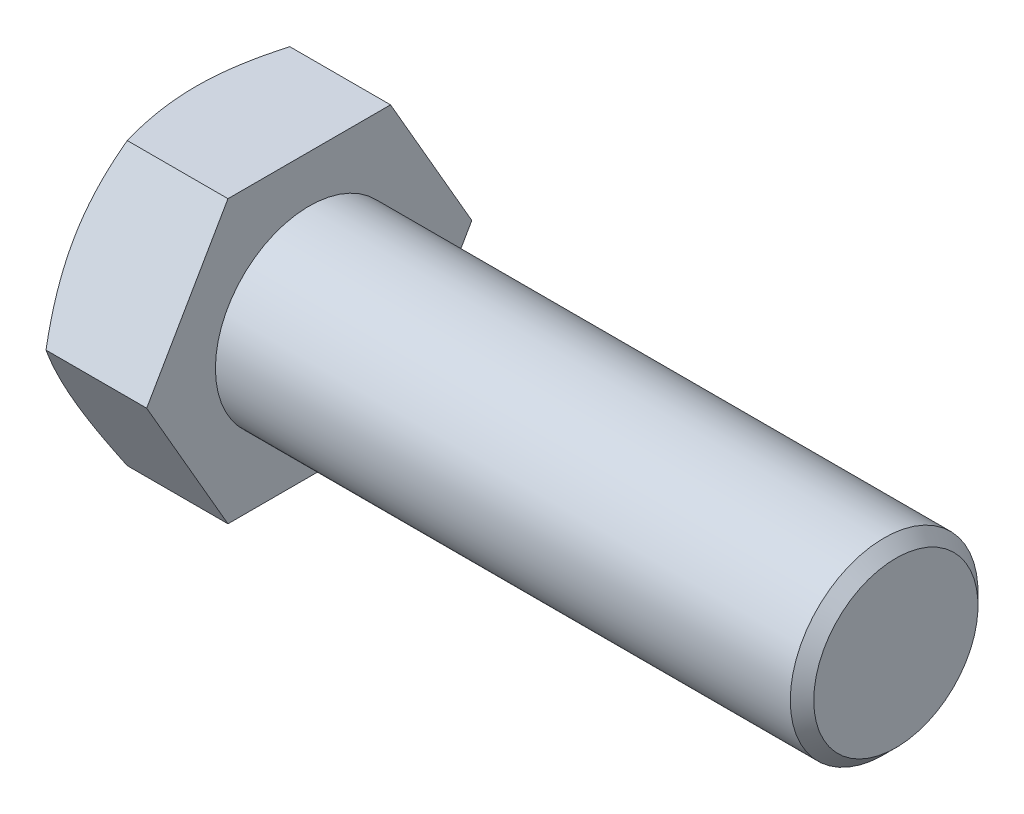
ISO-10303-21;
HEADER;
FILE_DESCRIPTION(('STEP AP214'),'2;1');
FILE_NAME('part.step','',(''),(''),'','','');
FILE_SCHEMA(('AUTOMOTIVE_DESIGN { 1 0 10303 214 1 1 1 1 }'));
ENDSEC;
DATA;
#1=APPLICATION_CONTEXT('core data for automotive mechanical design processes');
#2=APPLICATION_PROTOCOL_DEFINITION('international standard','automotive_design',2000,#1);
#3=PRODUCT_CONTEXT('',#1,'mechanical');
#4=PRODUCT('Part','Part','',(#3));
#5=PRODUCT_RELATED_PRODUCT_CATEGORY('part','',(#4));
#6=PRODUCT_DEFINITION_FORMATION('','',#4);
#7=PRODUCT_DEFINITION_CONTEXT('part definition',#1,'design');
#8=PRODUCT_DEFINITION('design','',#6,#7);
#9=PRODUCT_DEFINITION_SHAPE('','',#8);
#10=(LENGTH_UNIT() NAMED_UNIT(*) SI_UNIT(.MILLI.,.METRE.));
#11=(NAMED_UNIT(*) PLANE_ANGLE_UNIT() SI_UNIT($,.RADIAN.));
#12=(NAMED_UNIT(*) SI_UNIT($,.STERADIAN.) SOLID_ANGLE_UNIT());
#13=UNCERTAINTY_MEASURE_WITH_UNIT(LENGTH_MEASURE(1.E-05),#10,'distance_accuracy_value','');
#14=(GEOMETRIC_REPRESENTATION_CONTEXT(3) GLOBAL_UNCERTAINTY_ASSIGNED_CONTEXT((#13)) GLOBAL_UNIT_ASSIGNED_CONTEXT((#10,
#11,#12)) REPRESENTATION_CONTEXT('',''));
#15=CARTESIAN_POINT('',(0.,0.,0.));
#16=DIRECTION('',(0.,0.,1.));
#17=DIRECTION('',(1.,0.,0.));
#18=AXIS2_PLACEMENT_3D('',#15,#16,#17);
#19=CARTESIAN_POINT('',(5.,6.93,0.));
#20=DIRECTION('',(-1.,0.,0.));
#21=DIRECTION('',(0.,0.,1.));
#22=AXIS2_PLACEMENT_3D('',#19,#20,#21);
#23=PLANE('',#22);
#24=DIRECTION('',(0.,0.,-1.));
#25=VECTOR('',#24,1.);
#26=CARTESIAN_POINT('',(5.,-6.,0.));
#27=LINE('',#26,#25);
#28=CARTESIAN_POINT('',(5.,-6.,3.46410161513776));
#29=VERTEX_POINT('',#28);
#30=CARTESIAN_POINT('',(5.,-6.,-3.46410161513775));
#31=VERTEX_POINT('',#30);
#32=EDGE_CURVE('E91',#29,#31,#27,.T.);
#33=ORIENTED_EDGE('',*,*,#32,.T.);
#34=DIRECTION('',(0.,0.866025403784439,-0.5));
#35=VECTOR('',#34,1.);
#36=CARTESIAN_POINT('',(5.,2.1975,-8.19693044681971));
#37=LINE('',#36,#35);
#38=CARTESIAN_POINT('',(5.,0.,-6.92820323027551));
#39=VERTEX_POINT('',#38);
#40=EDGE_CURVE('E127',#31,#39,#37,.T.);
#41=ORIENTED_EDGE('',*,*,#40,.T.);
#42=DIRECTION('',(0.,0.866025403784439,0.5));
#43=VECTOR('',#42,1.);
#44=CARTESIAN_POINT('',(5.,8.1975,-2.19537439859355));
#45=LINE('',#44,#43);
#46=CARTESIAN_POINT('',(5.,6.,-3.46410161513775));
#47=VERTEX_POINT('',#46);
#48=EDGE_CURVE('E123',#39,#47,#45,.T.);
#49=ORIENTED_EDGE('',*,*,#48,.T.);
#50=DIRECTION('',(0.,0.,1.));
#51=VECTOR('',#50,1.);
#52=CARTESIAN_POINT('',(5.,6.,0.));
#53=LINE('',#52,#51);
#54=CARTESIAN_POINT('',(5.,6.,3.46410161513775));
#55=VERTEX_POINT('',#54);
#56=EDGE_CURVE('E117',#47,#55,#53,.T.);
#57=ORIENTED_EDGE('',*,*,#56,.T.);
#58=DIRECTION('',(0.,-0.866025403784439,0.5));
#59=VECTOR('',#58,1.);
#60=CARTESIAN_POINT('',(5.,8.1975,2.19537439859355));
#61=LINE('',#60,#59);
#62=CARTESIAN_POINT('',(5.,0.,6.92820323027551));
#63=VERTEX_POINT('',#62);
#64=EDGE_CURVE('E113',#55,#63,#61,.T.);
#65=ORIENTED_EDGE('',*,*,#64,.T.);
#66=DIRECTION('',(0.,-0.866025403784439,-0.5));
#67=VECTOR('',#66,1.);
#68=CARTESIAN_POINT('',(5.,2.1975,8.19693044681971));
#69=LINE('',#68,#67);
#70=EDGE_CURVE('E97',#63,#29,#69,.T.);
#71=ORIENTED_EDGE('',*,*,#70,.T.);
#72=EDGE_LOOP('',(#33,#41,#49,#57,#65,#71));
#73=FACE_BOUND('',#72,.T.);
#74=CARTESIAN_POINT('',(5.,0.,0.));
#75=DIRECTION('',(-1.,0.,0.));
#76=DIRECTION('',(0.,0.,1.));
#77=AXIS2_PLACEMENT_3D('',#74,#75,#76);
#78=CIRCLE('',#77,4.);
#79=CARTESIAN_POINT('',(5.,0.,4.));
#80=VERTEX_POINT('',#79);
#81=EDGE_CURVE('E298',#80,#80,#78,.T.);
#82=ORIENTED_EDGE('',*,*,#81,.T.);
#83=EDGE_LOOP('',(#82));
#84=FACE_BOUND('',#83,.T.);
#85=ADVANCED_FACE('F40',(#73,#84),#23,.F.);
#86=CARTESIAN_POINT('',(0.,0.,0.));
#87=DIRECTION('',(-1.,0.,0.));
#88=DIRECTION('',(0.,0.,1.));
#89=AXIS2_PLACEMENT_3D('',#86,#87,#88);
#90=CYLINDRICAL_SURFACE('',#89,4.);
#91=CARTESIAN_POINT('',(29.5,0.,0.));
#92=DIRECTION('',(-1.,0.,0.));
#93=DIRECTION('',(0.,0.,1.));
#94=AXIS2_PLACEMENT_3D('',#91,#92,#93);
#95=CIRCLE('',#94,4.);
#96=CARTESIAN_POINT('',(29.5,0.,4.));
#97=VERTEX_POINT('',#96);
#98=EDGE_CURVE('E49',#97,#97,#95,.T.);
#99=ORIENTED_EDGE('',*,*,#98,.T.);
#100=EDGE_LOOP('',(#99));
#101=FACE_BOUND('',#100,.T.);
#102=ORIENTED_EDGE('',*,*,#81,.F.);
#103=EDGE_LOOP('',(#102));
#104=FACE_BOUND('',#103,.T.);
#105=ADVANCED_FACE('F133',(#101,#104),#90,.T.);
#106=CARTESIAN_POINT('',(30.,4.,0.));
#107=DIRECTION('',(-1.,0.,0.));
#108=DIRECTION('',(0.,0.,1.));
#109=AXIS2_PLACEMENT_3D('',#106,#107,#108);
#110=PLANE('',#109);
#111=CARTESIAN_POINT('',(30.,0.,0.));
#112=DIRECTION('',(-1.,0.,0.));
#113=DIRECTION('',(0.,0.,1.));
#114=AXIS2_PLACEMENT_3D('',#111,#112,#113);
#115=CIRCLE('',#114,3.49999999999999);
#116=CARTESIAN_POINT('',(30.,0.,3.49999999999999));
#117=VERTEX_POINT('',#116);
#118=EDGE_CURVE('E12',#117,#117,#115,.F.);
#119=ORIENTED_EDGE('',*,*,#118,.T.);
#120=EDGE_LOOP('',(#119));
#121=FACE_BOUND('',#120,.T.);
#122=ADVANCED_FACE('F151',(#121),#110,.F.);
#123=CARTESIAN_POINT('',(30.,-6.,-3.46410161513775));
#124=DIRECTION('',(0.,0.5,0.866025403784439));
#125=DIRECTION('',(0.,-0.866025403784439,0.5));
#126=AXIS2_PLACEMENT_3D('',#123,#124,#125);
#127=PLANE('',#126);
#128=DIRECTION('',(-1.,0.,0.));
#129=VECTOR('',#128,1.);
#130=CARTESIAN_POINT('',(30.,0.,-6.92820323027551));
#131=LINE('',#130,#129);
#132=CARTESIAN_POINT('',(0.709103465619134,0.,-6.92820323027551));
#133=VERTEX_POINT('',#132);
#134=EDGE_CURVE('E307',#39,#133,#131,.T.);
#135=ORIENTED_EDGE('',*,*,#134,.F.);
#136=ORIENTED_EDGE('',*,*,#40,.F.);
#137=DIRECTION('',(-1.,0.,0.));
#138=VECTOR('',#137,1.);
#139=CARTESIAN_POINT('',(30.,-6.,-3.46410161513775));
#140=LINE('',#139,#138);
#141=CARTESIAN_POINT('',(0.709103465619136,-6.,-3.46410161513775));
#142=VERTEX_POINT('',#141);
#143=EDGE_CURVE('E61',#31,#142,#140,.T.);
#144=ORIENTED_EDGE('',*,*,#143,.T.);
#145=CARTESIAN_POINT('',(0.70917013395244,0.000200000000000979,-6.92831870032934));
#146=CARTESIAN_POINT('',(0.665214079872815,-0.131687014824874,-6.85217369681759));
#147=CARTESIAN_POINT('',(0.623252887977289,-0.264065768516573,-6.7757447877387));
#148=CARTESIAN_POINT('',(0.543869657551678,-0.529898336283079,-6.62226628317934));
#149=CARTESIAN_POINT('',(0.506449577152535,-0.66335258784951,-6.54521643511296));
#150=CARTESIAN_POINT('',(0.401735490843066,-1.06585213146133,-6.31283321525997));
#151=CARTESIAN_POINT('',(0.342175138138793,-1.33648623295938,-6.15658254390818));
#152=CARTESIAN_POINT('',(0.272333291472117,-1.74148524632806,-5.92275625451824));
#153=CARTESIAN_POINT('',(0.252437308808714,-1.87464004873788,-5.84587929350304));
#154=CARTESIAN_POINT('',(0.219074495555851,-2.14155132192066,-5.69177799808121));
#155=CARTESIAN_POINT('',(0.205607096915758,-2.27530773847834,-5.6145536949758));
#156=CARTESIAN_POINT('',(0.185444672507247,-2.54305288876907,-5.45997096038123));
#157=CARTESIAN_POINT('',(0.178741960756744,-2.67704118518633,-5.38261278137646));
#158=CARTESIAN_POINT('',(0.172245444167011,-2.94513416595058,-5.22782922676437));
#159=CARTESIAN_POINT('',(0.172451425904961,-3.07923884657427,-5.1504038533067));
#160=CARTESIAN_POINT('',(0.182512265982597,-3.44664501267683,-4.93828180440546));
#161=CARTESIAN_POINT('',(0.199402973759165,-3.6798262391765,-4.8036545605159));
#162=CARTESIAN_POINT('',(0.252964303547458,-4.14463991639404,-4.53529425885134));
#163=CARTESIAN_POINT('',(0.289653233720647,-4.3762707323519,-4.40156214490545));
#164=CARTESIAN_POINT('',(0.381365207452591,-4.84201989935198,-4.13266173796312));
#165=CARTESIAN_POINT('',(0.436776837467547,-5.07607947956512,-3.99752737632065));
#166=CARTESIAN_POINT('',(0.562538993940273,-5.54070808652961,-3.7292739250165));
#167=CARTESIAN_POINT('',(0.632859978073063,-5.77128306395569,-3.59615139973116));
#168=CARTESIAN_POINT('',(0.709170133952441,-6.0002,-3.46398614508391));
#169=B_SPLINE_CURVE_WITH_KNOTS('',3,(#145,#146,#147,#148,#149,#150,#151,#152,#153,#154,#155,
#156,#157,#158,#159,#160,#161,#162,#163,#164,#165,#166,#167,#168),.UNSPECIFIED.,.F.,.F.,(4,2,2,
2,2,2,2,2,2,2,2,4),(0.,0.475482194578525,0.951168694392477,1.90451835622161,2.36951738073402,
2.83447530880776,3.29890435872167,3.76331906154278,4.57182194271094,5.38107376137308,
6.20827406017204,7.03385036012984),.UNSPECIFIED.);
#170=EDGE_CURVE('E198',#133,#142,#169,.T.);
#171=ORIENTED_EDGE('',*,*,#170,.F.);
#172=EDGE_LOOP('',(#135,#136,#144,#171));
#173=FACE_BOUND('',#172,.T.);
#174=ADVANCED_FACE('F209',(#173),#127,.F.);
#175=CARTESIAN_POINT('',(30.,0.,-6.92820323027551));
#176=DIRECTION('',(0.,-0.5,0.866025403784439));
#177=DIRECTION('',(0.,-0.866025403784439,-0.5));
#178=AXIS2_PLACEMENT_3D('',#175,#176,#177);
#179=PLANE('',#178);
#180=DIRECTION('',(-1.,0.,0.));
#181=VECTOR('',#180,1.);
#182=CARTESIAN_POINT('',(30.,6.,-3.46410161513775));
#183=LINE('',#182,#181);
#184=CARTESIAN_POINT('',(0.709103465619136,6.,-3.46410161513775));
#185=VERTEX_POINT('',#184);
#186=EDGE_CURVE('E311',#47,#185,#183,.T.);
#187=ORIENTED_EDGE('',*,*,#186,.F.);
#188=ORIENTED_EDGE('',*,*,#48,.F.);
#189=ORIENTED_EDGE('',*,*,#134,.T.);
#190=CARTESIAN_POINT('',(0.709170133952441,6.0002,-3.46398614508392));
#191=CARTESIAN_POINT('',(0.665214079872817,5.86831298517512,-3.54013114859568));
#192=CARTESIAN_POINT('',(0.623252887977291,5.73593423148343,-3.61656005767457));
#193=CARTESIAN_POINT('',(0.543869657551679,5.47010166371692,-3.77003856223393));
#194=CARTESIAN_POINT('',(0.506449577152537,5.33664741215049,-3.84708841030031));
#195=CARTESIAN_POINT('',(0.401735490843067,4.93414786853867,-4.07947163015329));
#196=CARTESIAN_POINT('',(0.342175138138794,4.66351376704062,-4.23572230150508));
#197=CARTESIAN_POINT('',(0.272333291472118,4.25851475367194,-4.46954859089502));
#198=CARTESIAN_POINT('',(0.252437308808715,4.12535995126212,-4.54642555191022));
#199=CARTESIAN_POINT('',(0.219074495555852,3.85844867807933,-4.70052684733205));
#200=CARTESIAN_POINT('',(0.205607096915759,3.72469226152166,-4.77775115043746));
#201=CARTESIAN_POINT('',(0.185444672507248,3.45694711123092,-4.93233388503204));
#202=CARTESIAN_POINT('',(0.178741960756745,3.32295881481367,-5.0096920640368));
#203=CARTESIAN_POINT('',(0.172245444167012,3.05486583404941,-5.16447561864889));
#204=CARTESIAN_POINT('',(0.172451425904961,2.92076115342572,-5.24190099210657));
#205=CARTESIAN_POINT('',(0.182512265982598,2.55335498732317,-5.4540230410078));
#206=CARTESIAN_POINT('',(0.199402973759166,2.32017376082349,-5.58865028489736));
#207=CARTESIAN_POINT('',(0.252964303547459,1.85536008360595,-5.85701058656192));
#208=CARTESIAN_POINT('',(0.289653233720647,1.6237292676481,-5.99074270050781));
#209=CARTESIAN_POINT('',(0.38136520745259,1.15798010064802,-6.25964310745014));
#210=CARTESIAN_POINT('',(0.436776837467547,0.923920520434877,-6.39477746909261));
#211=CARTESIAN_POINT('',(0.562538993940272,0.45929191347039,-6.66303092039676));
#212=CARTESIAN_POINT('',(0.632859978073062,0.22871693604431,-6.7961534456821));
#213=CARTESIAN_POINT('',(0.709170133952439,-0.000199999999998661,-6.92831870032934));
#214=B_SPLINE_CURVE_WITH_KNOTS('',3,(#190,#191,#192,#193,#194,#195,#196,#197,#198,#199,#200,
#201,#202,#203,#204,#205,#206,#207,#208,#209,#210,#211,#212,#213),.UNSPECIFIED.,.F.,.F.,(4,2,2,
2,2,2,2,2,2,2,2,4),(0.,0.475482194578525,0.951168694392478,1.90451835622162,2.36951738073402,
2.83447530880776,3.29890435872167,3.76331906154279,4.57182194271094,5.38107376137308,
6.20827406017204,7.03385036012983),.UNSPECIFIED.);
#215=EDGE_CURVE('E190',#185,#133,#214,.T.);
#216=ORIENTED_EDGE('',*,*,#215,.F.);
#217=EDGE_LOOP('',(#187,#188,#189,#216));
#218=FACE_BOUND('',#217,.T.);
#219=ADVANCED_FACE('F205',(#218),#179,.F.);
#220=CARTESIAN_POINT('',(30.,6.,-3.46410161513775));
#221=DIRECTION('',(0.,-1.,0.));
#222=DIRECTION('',(0.,0.,-1.));
#223=AXIS2_PLACEMENT_3D('',#220,#221,#222);
#224=PLANE('',#223);
#225=DIRECTION('',(-1.,0.,0.));
#226=VECTOR('',#225,1.);
#227=CARTESIAN_POINT('',(30.,6.,3.46410161513775));
#228=LINE('',#227,#226);
#229=CARTESIAN_POINT('',(0.709103465619136,6.,3.46410161513775));
#230=VERTEX_POINT('',#229);
#231=EDGE_CURVE('E314',#55,#230,#228,.T.);
#232=ORIENTED_EDGE('',*,*,#231,.F.);
#233=ORIENTED_EDGE('',*,*,#56,.F.);
#234=ORIENTED_EDGE('',*,*,#186,.T.);
#235=CARTESIAN_POINT('',(3.03283676434467,6.,-9.16344959609807));
#236=CARTESIAN_POINT('',(2.90571955629185,6.,-8.90020054235232));
#237=CARTESIAN_POINT('',(2.77987333340906,6.,-8.63632637062928));
#238=CARTESIAN_POINT('',(2.53144970652769,6.,-8.10698968316018));
#239=CARTESIAN_POINT('',(2.40887287402576,6.,-7.84152689952285));
#240=CARTESIAN_POINT('',(2.16706390592548,6.,-7.30722902940922));
#241=CARTESIAN_POINT('',(2.04785515142807,6.,-7.0383833226896));
#242=CARTESIAN_POINT('',(1.81459244314004,6.,-6.49847336936283));
#243=CARTESIAN_POINT('',(1.70053821881707,6.,-6.22740924007223));
#244=CARTESIAN_POINT('',(1.47764770309838,6.,-5.67937770477254));
#245=CARTESIAN_POINT('',(1.36888937269533,6.,-5.40237841590288));
#246=CARTESIAN_POINT('',(1.15995044588674,6.,-4.84510394946963));
#247=CARTESIAN_POINT('',(1.05977080578225,6.,-4.56482841063686));
#248=CARTESIAN_POINT('',(0.8706982242743,6.,-4.0011402074949));
#249=CARTESIAN_POINT('',(0.781781076922854,6.,-3.71773574506835));
#250=CARTESIAN_POINT('',(0.618137659127107,6.,-3.14689607642442));
#251=CARTESIAN_POINT('',(0.54340688112228,6.,-2.8594621817906));
#252=CARTESIAN_POINT('',(0.411773172972363,6.,-2.28037162217122));
#253=CARTESIAN_POINT('',(0.354876255706452,6.,-1.98871356756528));
#254=CARTESIAN_POINT('',(0.262775971821758,6.,-1.40186717189927));
#255=CARTESIAN_POINT('',(0.227572651847311,6.,-1.10667882324995));
#256=CARTESIAN_POINT('',(0.193295050458916,6.,-0.663440755624254));
#257=CARTESIAN_POINT('',(0.184954599009015,6.,-0.516069903638457));
#258=CARTESIAN_POINT('',(0.174515923815648,6.,-0.22110086673428));
#259=CARTESIAN_POINT('',(0.172417606528558,6.,-0.0735026852557881));
#260=CARTESIAN_POINT('',(0.174520203430734,6.,0.221606591575967));
#261=CARTESIAN_POINT('',(0.178719369550875,6.,0.369117699729807));
#262=CARTESIAN_POINT('',(0.193311279411762,6.,0.663835780663147));
#263=CARTESIAN_POINT('',(0.203704357134786,6.,0.811042736612899));
#264=CARTESIAN_POINT('',(0.23624561204161,6.,1.16848757669308));
#265=CARTESIAN_POINT('',(0.261534008461897,6.,1.3784450311157));
#266=CARTESIAN_POINT('',(0.323297892402542,6.,1.79669912000344));
#267=CARTESIAN_POINT('',(0.359775060391457,6.,2.00499550016296));
#268=CARTESIAN_POINT('',(0.484158514092054,6.,2.62776425453866));
#269=CARTESIAN_POINT('',(0.586933080864973,6.,3.03930056253789));
#270=CARTESIAN_POINT('',(0.76394559108196,6.,3.65484328751152));
#271=CARTESIAN_POINT('',(0.827616308079218,6.,3.86207082271192));
#272=CARTESIAN_POINT('',(0.96125716748294,6.,4.27452399256909));
#273=CARTESIAN_POINT('',(1.03122787505245,6.,4.47974944578796));
#274=CARTESIAN_POINT('',(1.17597309511122,6.,4.88717368073079));
#275=CARTESIAN_POINT('',(1.25071820391626,6.,5.08938301544432));
#276=CARTESIAN_POINT('',(1.4045057017134,6.,5.4920841757007));
#277=CARTESIAN_POINT('',(1.48354659816671,6.,5.6925765701083));
#278=CARTESIAN_POINT('',(1.56433254852037,6.,5.89234659048072));
#279=B_SPLINE_CURVE_WITH_KNOTS('',3,(#235,#236,#237,#238,#239,#240,#241,#242,#243,#244,#245,
#246,#247,#248,#249,#250,#251,#252,#253,#254,#255,#256,#257,#258,#259,#260,#261,#262,#263,#264,
#265,#266,#267,#268,#269,#270,#271,#272,#273,#274,#275,#276,#277,#278),.UNSPECIFIED.,.F.,.F.,(4,
2,2,2,2,2,2,2,2,2,2,2,2,2,2,2,2,2,2,2,2,4),(0.,0.877012273065058,1.75417685822489,
2.63640291555732,3.51858261589522,4.41122869564789,5.30397415306082,6.19476708612845,
7.08527650419315,7.97608584498257,8.86689710113275,9.30960479627054,9.75230585702824,
10.1948840546068,10.6374861186302,11.2715502206419,11.9057096009375,13.1764773170028,
13.8267926436842,14.4771663674498,15.1238621612739,15.7703346843615),.UNSPECIFIED.);
#280=EDGE_CURVE('E183',#230,#185,#279,.F.);
#281=ORIENTED_EDGE('',*,*,#280,.F.);
#282=EDGE_LOOP('',(#232,#233,#234,#281));
#283=FACE_BOUND('',#282,.T.);
#284=ADVANCED_FACE('F208',(#283),#224,.F.);
#285=CARTESIAN_POINT('',(30.,6.,3.46410161513775));
#286=DIRECTION('',(0.,-0.5,-0.866025403784438));
#287=DIRECTION('',(0.,0.866025403784439,-0.5));
#288=AXIS2_PLACEMENT_3D('',#285,#286,#287);
#289=PLANE('',#288);
#290=DIRECTION('',(-1.,0.,0.));
#291=VECTOR('',#290,1.);
#292=CARTESIAN_POINT('',(30.,0.,6.92820323027551));
#293=LINE('',#292,#291);
#294=CARTESIAN_POINT('',(0.709103465619136,0.,6.92820323027551));
#295=VERTEX_POINT('',#294);
#296=EDGE_CURVE('E108',#63,#295,#293,.T.);
#297=ORIENTED_EDGE('',*,*,#296,.F.);
#298=ORIENTED_EDGE('',*,*,#64,.F.);
#299=ORIENTED_EDGE('',*,*,#231,.T.);
#300=CARTESIAN_POINT('',(0.709170133952441,-0.000199999999999917,6.92831870032935));
#301=CARTESIAN_POINT('',(0.665214079872816,0.131687014824876,6.85217369681759));
#302=CARTESIAN_POINT('',(0.62325288797729,0.264065768516574,6.7757447877387));
#303=CARTESIAN_POINT('',(0.543869657551679,0.529898336283081,6.62226628317934));
#304=CARTESIAN_POINT('',(0.506449577152536,0.663352587849512,6.54521643511296));
#305=CARTESIAN_POINT('',(0.401735490843067,1.06585213146133,6.31283321525997));
#306=CARTESIAN_POINT('',(0.342175138138795,1.33648623295938,6.15658254390818));
#307=CARTESIAN_POINT('',(0.272333291472118,1.74148524632806,5.92275625451824));
#308=CARTESIAN_POINT('',(0.252437308808715,1.87464004873788,5.84587929350304));
#309=CARTESIAN_POINT('',(0.219074495555851,2.14155132192066,5.69177799808121));
#310=CARTESIAN_POINT('',(0.205607096915758,2.27530773847834,5.6145536949758));
#311=CARTESIAN_POINT('',(0.185444672507248,2.54305288876907,5.45997096038123));
#312=CARTESIAN_POINT('',(0.178741960756745,2.67704118518633,5.38261278137647));
#313=CARTESIAN_POINT('',(0.172245444167012,2.94513416595058,5.22782922676437));
#314=CARTESIAN_POINT('',(0.172451425904961,3.07923884657427,5.1504038533067));
#315=CARTESIAN_POINT('',(0.182512265982597,3.44664501267683,4.93828180440546));
#316=CARTESIAN_POINT('',(0.199402973759165,3.6798262391765,4.80365456051591));
#317=CARTESIAN_POINT('',(0.252964303547459,4.14463991639405,4.53529425885134));
#318=CARTESIAN_POINT('',(0.289653233720647,4.3762707323519,4.40156214490546));
#319=CARTESIAN_POINT('',(0.381365207452591,4.84201989935198,4.13266173796312));
#320=CARTESIAN_POINT('',(0.436776837467547,5.07607947956512,3.99752737632065));
#321=CARTESIAN_POINT('',(0.562538993940273,5.54070808652961,3.7292739250165));
#322=CARTESIAN_POINT('',(0.632859978073064,5.77128306395569,3.59615139973116));
#323=CARTESIAN_POINT('',(0.709170133952441,6.0002,3.46398614508392));
#324=B_SPLINE_CURVE_WITH_KNOTS('',3,(#300,#301,#302,#303,#304,#305,#306,#307,#308,#309,#310,
#311,#312,#313,#314,#315,#316,#317,#318,#319,#320,#321,#322,#323),.UNSPECIFIED.,.F.,.F.,(4,2,2,
2,2,2,2,2,2,2,2,4),(0.,0.475482194578526,0.951168694392479,1.90451835622162,2.36951738073402,
2.83447530880776,3.29890435872167,3.76331906154278,4.57182194271094,5.38107376137308,
6.20827406017204,7.03385036012984),.UNSPECIFIED.);
#325=EDGE_CURVE('E176',#295,#230,#324,.T.);
#326=ORIENTED_EDGE('',*,*,#325,.F.);
#327=EDGE_LOOP('',(#297,#298,#299,#326));
#328=FACE_BOUND('',#327,.T.);
#329=ADVANCED_FACE('F235',(#328),#289,.F.);
#330=CARTESIAN_POINT('',(30.,0.,6.92820323027551));
#331=DIRECTION('',(0.,0.5,-0.866025403784439));
#332=DIRECTION('',(0.,0.866025403784439,0.5));
#333=AXIS2_PLACEMENT_3D('',#330,#331,#332);
#334=PLANE('',#333);
#335=DIRECTION('',(-1.,0.,0.));
#336=VECTOR('',#335,1.);
#337=CARTESIAN_POINT('',(30.,-6.,3.46410161513776));
#338=LINE('',#337,#336);
#339=CARTESIAN_POINT('',(0.709103465619136,-6.,3.46410161513776));
#340=VERTEX_POINT('',#339);
#341=EDGE_CURVE('E56',#29,#340,#338,.T.);
#342=ORIENTED_EDGE('',*,*,#341,.F.);
#343=ORIENTED_EDGE('',*,*,#70,.F.);
#344=ORIENTED_EDGE('',*,*,#296,.T.);
#345=CARTESIAN_POINT('',(0.709170133952442,-6.0002,3.46398614508392));
#346=CARTESIAN_POINT('',(0.665214079872817,-5.86831298517512,3.54013114859568));
#347=CARTESIAN_POINT('',(0.623252887977291,-5.73593423148343,3.61656005767457));
#348=CARTESIAN_POINT('',(0.543869657551679,-5.47010166371692,3.77003856223393));
#349=CARTESIAN_POINT('',(0.506449577152537,-5.33664741215049,3.84708841030031));
#350=CARTESIAN_POINT('',(0.401735490843068,-4.93414786853867,4.07947163015329));
#351=CARTESIAN_POINT('',(0.342175138138795,-4.66351376704062,4.23572230150508));
#352=CARTESIAN_POINT('',(0.272333291472118,-4.25851475367194,4.46954859089502));
#353=CARTESIAN_POINT('',(0.252437308808715,-4.12535995126212,4.54642555191022));
#354=CARTESIAN_POINT('',(0.219074495555852,-3.85844867807933,4.70052684733205));
#355=CARTESIAN_POINT('',(0.205607096915759,-3.72469226152166,4.77775115043747));
#356=CARTESIAN_POINT('',(0.185444672507249,-3.45694711123092,4.93233388503204));
#357=CARTESIAN_POINT('',(0.178741960756745,-3.32295881481367,5.0096920640368));
#358=CARTESIAN_POINT('',(0.172245444167012,-3.05486583404941,5.16447561864889));
#359=CARTESIAN_POINT('',(0.172451425904962,-2.92076115342572,5.24190099210657));
#360=CARTESIAN_POINT('',(0.182512265982599,-2.55335498732317,5.45402304100781));
#361=CARTESIAN_POINT('',(0.199402973759166,-2.32017376082349,5.58865028489736));
#362=CARTESIAN_POINT('',(0.252964303547459,-1.85536008360595,5.85701058656193));
#363=CARTESIAN_POINT('',(0.289653233720648,-1.6237292676481,5.99074270050781));
#364=CARTESIAN_POINT('',(0.381365207452591,-1.15798010064802,6.25964310745014));
#365=CARTESIAN_POINT('',(0.436776837467548,-0.923920520434877,6.39477746909261));
#366=CARTESIAN_POINT('',(0.562538993940273,-0.459291913470389,6.66303092039676));
#367=CARTESIAN_POINT('',(0.632859978073063,-0.228716936044309,6.7961534456821));
#368=CARTESIAN_POINT('',(0.709170133952441,0.00019999999999979,6.92831870032935));
#369=B_SPLINE_CURVE_WITH_KNOTS('',3,(#345,#346,#347,#348,#349,#350,#351,#352,#353,#354,#355,
#356,#357,#358,#359,#360,#361,#362,#363,#364,#365,#366,#367,#368),.UNSPECIFIED.,.F.,.F.,(4,2,2,
2,2,2,2,2,2,2,2,4),(0.,0.475482194578525,0.951168694392478,1.90451835622162,2.36951738073402,
2.83447530880777,3.29890435872168,3.76331906154279,4.57182194271094,5.38107376137308,
6.20827406017204,7.03385036012984),.UNSPECIFIED.);
#370=EDGE_CURVE('E105',#340,#295,#369,.T.);
#371=ORIENTED_EDGE('',*,*,#370,.F.);
#372=EDGE_LOOP('',(#342,#343,#344,#371));
#373=FACE_BOUND('',#372,.T.);
#374=ADVANCED_FACE('F101',(#373),#334,.F.);
#375=CARTESIAN_POINT('',(30.,-6.,3.46410161513776));
#376=DIRECTION('',(0.,1.,0.));
#377=DIRECTION('',(0.,0.,1.));
#378=AXIS2_PLACEMENT_3D('',#375,#376,#377);
#379=PLANE('',#378);
#380=ORIENTED_EDGE('',*,*,#143,.F.);
#381=ORIENTED_EDGE('',*,*,#32,.F.);
#382=ORIENTED_EDGE('',*,*,#341,.T.);
#383=CARTESIAN_POINT('',(3.03283676434467,-6.,-9.16344959609807));
#384=CARTESIAN_POINT('',(2.90571955629185,-6.,-8.90020054235231));
#385=CARTESIAN_POINT('',(2.77987333340906,-6.,-8.63632637062927));
#386=CARTESIAN_POINT('',(2.53144970652769,-6.,-8.10698968316017));
#387=CARTESIAN_POINT('',(2.40887287402576,-6.,-7.84152689952284));
#388=CARTESIAN_POINT('',(2.16706390592548,-6.,-7.30722902940922));
#389=CARTESIAN_POINT('',(2.04785515142807,-6.,-7.0383833226896));
#390=CARTESIAN_POINT('',(1.81459244314004,-6.,-6.49847336936283));
#391=CARTESIAN_POINT('',(1.70053821881707,-6.,-6.22740924007223));
#392=CARTESIAN_POINT('',(1.47764770309838,-6.,-5.67937770477254));
#393=CARTESIAN_POINT('',(1.36888937269533,-6.,-5.40237841590287));
#394=CARTESIAN_POINT('',(1.15995044588674,-6.,-4.84510394946963));
#395=CARTESIAN_POINT('',(1.05977080578225,-6.,-4.56482841063686));
#396=CARTESIAN_POINT('',(0.8706982242743,-6.,-4.0011402074949));
#397=CARTESIAN_POINT('',(0.781781076922854,-6.,-3.71773574506834));
#398=CARTESIAN_POINT('',(0.618137659127108,-6.,-3.14689607642442));
#399=CARTESIAN_POINT('',(0.54340688112228,-6.,-2.85946218179059));
#400=CARTESIAN_POINT('',(0.411773172972364,-6.,-2.28037162217121));
#401=CARTESIAN_POINT('',(0.354876255706453,-6.,-1.98871356756528));
#402=CARTESIAN_POINT('',(0.262775971821759,-6.,-1.40186717189927));
#403=CARTESIAN_POINT('',(0.227572651847312,-6.,-1.10667882324995));
#404=CARTESIAN_POINT('',(0.193295050458916,-6.,-0.663440755624251));
#405=CARTESIAN_POINT('',(0.184954599009015,-6.,-0.516069903638454));
#406=CARTESIAN_POINT('',(0.174515923815648,-6.,-0.221100866734278));
#407=CARTESIAN_POINT('',(0.172417606528558,-6.,-0.0735026852557866));
#408=CARTESIAN_POINT('',(0.174520203430734,-6.,0.221606591575969));
#409=CARTESIAN_POINT('',(0.178719369550875,-6.,0.369117699729809));
#410=CARTESIAN_POINT('',(0.193311279411762,-6.,0.66383578066315));
#411=CARTESIAN_POINT('',(0.203704357134786,-6.,0.811042736612901));
#412=CARTESIAN_POINT('',(0.23624561204161,-6.,1.16848757669308));
#413=CARTESIAN_POINT('',(0.261534008461897,-6.,1.3784450311157));
#414=CARTESIAN_POINT('',(0.323297892402543,-6.,1.79669912000344));
#415=CARTESIAN_POINT('',(0.359775060391458,-6.,2.00499550016296));
#416=CARTESIAN_POINT('',(0.484158514092054,-6.,2.62776425453866));
#417=CARTESIAN_POINT('',(0.586933080864974,-6.,3.03930056253789));
#418=CARTESIAN_POINT('',(0.76394559108196,-6.,3.65484328751152));
#419=CARTESIAN_POINT('',(0.827616308079218,-6.,3.86207082271193));
#420=CARTESIAN_POINT('',(0.96125716748294,-6.,4.2745239925691));
#421=CARTESIAN_POINT('',(1.03122787505245,-6.,4.47974944578796));
#422=CARTESIAN_POINT('',(1.17597309511122,-6.,4.88717368073079));
#423=CARTESIAN_POINT('',(1.25071820391626,-6.,5.08938301544433));
#424=CARTESIAN_POINT('',(1.4045057017134,-6.,5.4920841757007));
#425=CARTESIAN_POINT('',(1.48354659816672,-6.,5.69257657010831));
#426=CARTESIAN_POINT('',(1.56433254852037,-6.,5.89234659048072));
#427=B_SPLINE_CURVE_WITH_KNOTS('',3,(#383,#384,#385,#386,#387,#388,#389,#390,#391,#392,#393,
#394,#395,#396,#397,#398,#399,#400,#401,#402,#403,#404,#405,#406,#407,#408,#409,#410,#411,#412,
#413,#414,#415,#416,#417,#418,#419,#420,#421,#422,#423,#424,#425,#426),.UNSPECIFIED.,.F.,.F.,(4,
2,2,2,2,2,2,2,2,2,2,2,2,2,2,2,2,2,2,2,2,4),(0.,0.87701227306506,1.75417685822489,
2.63640291555732,3.51858261589522,4.41122869564789,5.30397415306082,6.19476708612845,
7.08527650419315,7.97608584498257,8.86689710113275,9.30960479627054,9.75230585702823,
10.1948840546068,10.6374861186302,11.2715502206419,11.9057096009375,13.1764773170028,
13.8267926436842,14.4771663674498,15.1238621612739,15.7703346843615),.UNSPECIFIED.);
#428=EDGE_CURVE('E158',#142,#340,#427,.T.);
#429=ORIENTED_EDGE('',*,*,#428,.F.);
#430=EDGE_LOOP('',(#380,#381,#382,#429));
#431=FACE_BOUND('',#430,.T.);
#432=ADVANCED_FACE('F92',(#431),#379,.F.);
#433=CARTESIAN_POINT('',(0.,0.,0.));
#434=DIRECTION('',(1.,0.,0.));
#435=DIRECTION('',(0.,0.,-1.));
#436=AXIS2_PLACEMENT_3D('',#433,#434,#435);
#437=PLANE('',#436);
#438=CARTESIAN_POINT('',(0.,0.,0.));
#439=DIRECTION('',(-1.,0.,0.));
#440=DIRECTION('',(0.,0.,1.));
#441=AXIS2_PLACEMENT_3D('',#438,#439,#440);
#442=CIRCLE('',#441,5.7);
#443=CARTESIAN_POINT('',(0.,0.,5.7));
#444=VERTEX_POINT('',#443);
#445=EDGE_CURVE('E98',#444,#444,#442,.T.);
#446=ORIENTED_EDGE('',*,*,#445,.T.);
#447=EDGE_LOOP('',(#446));
#448=FACE_BOUND('',#447,.T.);
#449=ADVANCED_FACE('F142',(#448),#437,.F.);
#450=CARTESIAN_POINT('',(0.710140831103242,0.,0.));
#451=DIRECTION('',(1.,0.,0.));
#452=DIRECTION('',(0.,0.,-1.));
#453=AXIS2_PLACEMENT_3D('',#450,#451,#452);
#454=CONICAL_SURFACE('',#453,6.93,1.0471975511966);
#455=ORIENTED_EDGE('',*,*,#215,.T.);
#456=ORIENTED_EDGE('',*,*,#170,.T.);
#457=ORIENTED_EDGE('',*,*,#428,.T.);
#458=ORIENTED_EDGE('',*,*,#370,.T.);
#459=ORIENTED_EDGE('',*,*,#325,.T.);
#460=ORIENTED_EDGE('',*,*,#280,.T.);
#461=EDGE_LOOP('',(#455,#456,#457,#458,#459,#460));
#462=FACE_BOUND('',#461,.T.);
#463=ORIENTED_EDGE('',*,*,#445,.F.);
#464=EDGE_LOOP('',(#463));
#465=FACE_BOUND('',#464,.T.);
#466=ADVANCED_FACE('F137',(#462,#465),#454,.T.);
#467=CARTESIAN_POINT('',(29.5,0.,0.));
#468=DIRECTION('',(-1.,0.,0.));
#469=DIRECTION('',(0.,0.,1.));
#470=AXIS2_PLACEMENT_3D('',#467,#468,#469);
#471=CONICAL_SURFACE('',#470,4.,0.785398163397452);
#472=ORIENTED_EDGE('',*,*,#118,.F.);
#473=EDGE_LOOP('',(#472));
#474=FACE_BOUND('',#473,.T.);
#475=ORIENTED_EDGE('',*,*,#98,.F.);
#476=EDGE_LOOP('',(#475));
#477=FACE_BOUND('',#476,.T.);
#478=ADVANCED_FACE('F42',(#474,#477),#471,.T.);
#479=CLOSED_SHELL('',(#85,#105,#122,#174,#219,#284,#329,#374,#432,#449,#466,#478));
#480=MANIFOLD_SOLID_BREP('B2',#479);
#481=ADVANCED_BREP_SHAPE_REPRESENTATION('',(#18,#480),#14);
#482=SHAPE_DEFINITION_REPRESENTATION(#9,#481);
ENDSEC;
END-ISO-10303-21;
